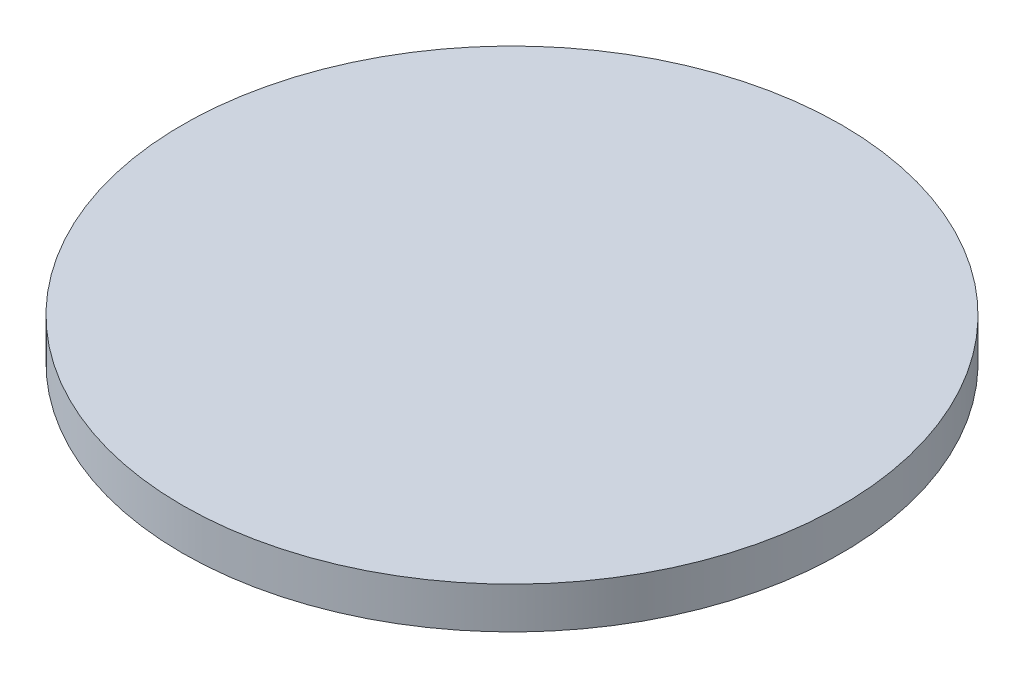
ISO-10303-21;
HEADER;
FILE_DESCRIPTION(('STEP AP214'),'2;1');
FILE_NAME('part.step','',(''),(''),'','','');
FILE_SCHEMA(('AUTOMOTIVE_DESIGN { 1 0 10303 214 1 1 1 1 }'));
ENDSEC;
DATA;
#1=APPLICATION_CONTEXT('core data for automotive mechanical design processes');
#2=APPLICATION_PROTOCOL_DEFINITION('international standard','automotive_design',2000,#1);
#3=PRODUCT_CONTEXT('',#1,'mechanical');
#4=PRODUCT('Part','Part','',(#3));
#5=PRODUCT_RELATED_PRODUCT_CATEGORY('part','',(#4));
#6=PRODUCT_DEFINITION_FORMATION('','',#4);
#7=PRODUCT_DEFINITION_CONTEXT('part definition',#1,'design');
#8=PRODUCT_DEFINITION('design','',#6,#7);
#9=PRODUCT_DEFINITION_SHAPE('','',#8);
#10=(LENGTH_UNIT() NAMED_UNIT(*) SI_UNIT(.MILLI.,.METRE.));
#11=(NAMED_UNIT(*) PLANE_ANGLE_UNIT() SI_UNIT($,.RADIAN.));
#12=(NAMED_UNIT(*) SI_UNIT($,.STERADIAN.) SOLID_ANGLE_UNIT());
#13=UNCERTAINTY_MEASURE_WITH_UNIT(LENGTH_MEASURE(1.E-05),#10,'distance_accuracy_value','');
#14=(GEOMETRIC_REPRESENTATION_CONTEXT(3) GLOBAL_UNCERTAINTY_ASSIGNED_CONTEXT((#13)) GLOBAL_UNIT_ASSIGNED_CONTEXT((#10,
#11,#12)) REPRESENTATION_CONTEXT('',''));
#15=CARTESIAN_POINT('',(0.,0.,0.));
#16=DIRECTION('',(0.,0.,1.));
#17=DIRECTION('',(1.,0.,0.));
#18=AXIS2_PLACEMENT_3D('',#15,#16,#17);
#19=CARTESIAN_POINT('',(0.,3.,0.));
#20=DIRECTION('',(0.,-1.,0.));
#21=DIRECTION('',(0.,0.,-1.));
#22=AXIS2_PLACEMENT_3D('',#19,#20,#21);
#23=CYLINDRICAL_SURFACE('',#22,23.875);
#24=CARTESIAN_POINT('',(0.,3.,0.));
#25=DIRECTION('',(0.,1.,0.));
#26=DIRECTION('',(0.,0.,1.));
#27=AXIS2_PLACEMENT_3D('',#24,#25,#26);
#28=CIRCLE('',#27,23.875);
#29=CARTESIAN_POINT('',(0.,3.,23.875));
#30=VERTEX_POINT('',#29);
#31=EDGE_CURVE('E10',#30,#30,#28,.T.);
#32=ORIENTED_EDGE('',*,*,#31,.F.);
#33=EDGE_LOOP('',(#32));
#34=FACE_BOUND('',#33,.T.);
#35=CARTESIAN_POINT('',(0.,0.,0.));
#36=DIRECTION('',(0.,1.,0.));
#37=DIRECTION('',(0.,0.,1.));
#38=AXIS2_PLACEMENT_3D('',#35,#36,#37);
#39=CIRCLE('',#38,23.875);
#40=CARTESIAN_POINT('',(0.,0.,23.875));
#41=VERTEX_POINT('',#40);
#42=EDGE_CURVE('E40',#41,#41,#39,.T.);
#43=ORIENTED_EDGE('',*,*,#42,.T.);
#44=EDGE_LOOP('',(#43));
#45=FACE_BOUND('',#44,.T.);
#46=ADVANCED_FACE('F37',(#34,#45),#23,.T.);
#47=CARTESIAN_POINT('',(0.,3.,0.));
#48=DIRECTION('',(0.,1.,0.));
#49=DIRECTION('',(0.,0.,1.));
#50=AXIS2_PLACEMENT_3D('',#47,#48,#49);
#51=PLANE('',#50);
#52=ORIENTED_EDGE('',*,*,#31,.T.);
#53=EDGE_LOOP('',(#52));
#54=FACE_BOUND('',#53,.T.);
#55=ADVANCED_FACE('F54',(#54),#51,.T.);
#56=CARTESIAN_POINT('',(0.,0.,0.));
#57=DIRECTION('',(0.,1.,0.));
#58=DIRECTION('',(0.,0.,1.));
#59=AXIS2_PLACEMENT_3D('',#56,#57,#58);
#60=PLANE('',#59);
#61=ORIENTED_EDGE('',*,*,#42,.F.);
#62=EDGE_LOOP('',(#61));
#63=FACE_BOUND('',#62,.T.);
#64=ADVANCED_FACE('F52',(#63),#60,.F.);
#65=CLOSED_SHELL('',(#46,#55,#64));
#66=MANIFOLD_SOLID_BREP('B2',#65);
#67=ADVANCED_BREP_SHAPE_REPRESENTATION('',(#18,#66),#14);
#68=SHAPE_DEFINITION_REPRESENTATION(#9,#67);
ENDSEC;
END-ISO-10303-21;
